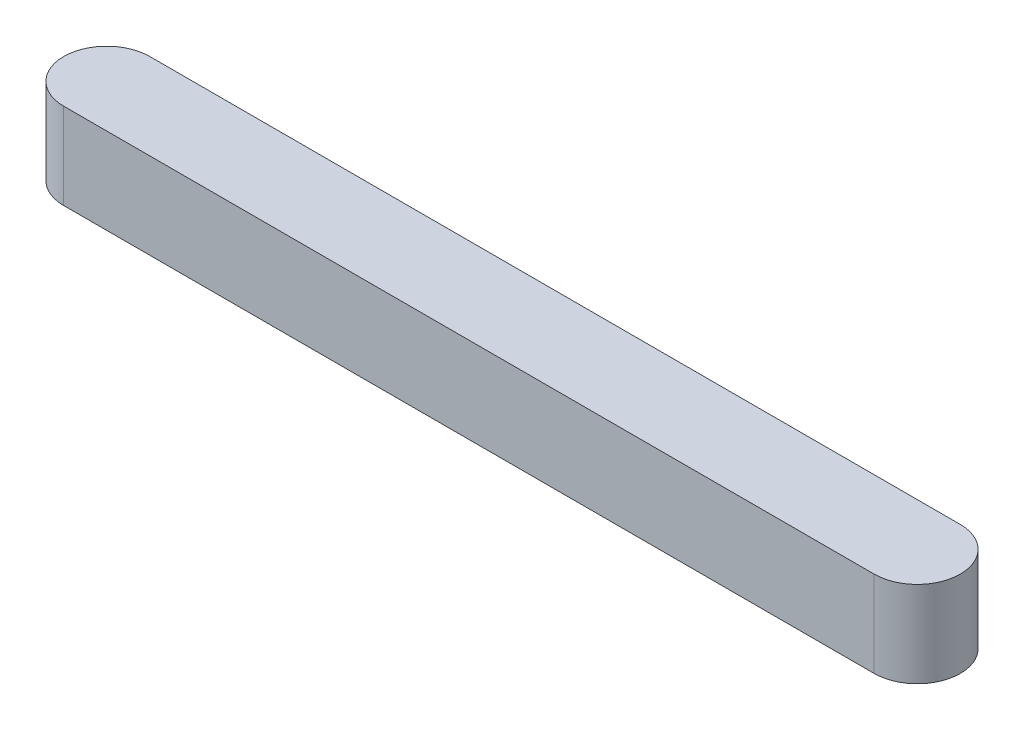
ISO-10303-21;
HEADER;
FILE_DESCRIPTION(('STEP AP214'),'2;1');
FILE_NAME('part.step','',(''),(''),'','','');
FILE_SCHEMA(('AUTOMOTIVE_DESIGN { 1 0 10303 214 1 1 1 1 }'));
ENDSEC;
DATA;
#1=APPLICATION_CONTEXT('core data for automotive mechanical design processes');
#2=APPLICATION_PROTOCOL_DEFINITION('international standard','automotive_design',2000,#1);
#3=PRODUCT_CONTEXT('',#1,'mechanical');
#4=PRODUCT('Part','Part','',(#3));
#5=PRODUCT_RELATED_PRODUCT_CATEGORY('part','',(#4));
#6=PRODUCT_DEFINITION_FORMATION('','',#4);
#7=PRODUCT_DEFINITION_CONTEXT('part definition',#1,'design');
#8=PRODUCT_DEFINITION('design','',#6,#7);
#9=PRODUCT_DEFINITION_SHAPE('','',#8);
#10=(LENGTH_UNIT() NAMED_UNIT(*) SI_UNIT(.MILLI.,.METRE.));
#11=(NAMED_UNIT(*) PLANE_ANGLE_UNIT() SI_UNIT($,.RADIAN.));
#12=(NAMED_UNIT(*) SI_UNIT($,.STERADIAN.) SOLID_ANGLE_UNIT());
#13=UNCERTAINTY_MEASURE_WITH_UNIT(LENGTH_MEASURE(1.E-05),#10,'distance_accuracy_value','');
#14=(GEOMETRIC_REPRESENTATION_CONTEXT(3) GLOBAL_UNCERTAINTY_ASSIGNED_CONTEXT((#13)) GLOBAL_UNIT_ASSIGNED_CONTEXT((#10,
#11,#12)) REPRESENTATION_CONTEXT('',''));
#15=CARTESIAN_POINT('',(0.,0.,0.));
#16=DIRECTION('',(0.,0.,1.));
#17=DIRECTION('',(1.,0.,0.));
#18=AXIS2_PLACEMENT_3D('',#15,#16,#17);
#19=CARTESIAN_POINT('',(-56.5,12.,0.));
#20=DIRECTION('',(0.,-1.,0.));
#21=DIRECTION('',(0.,0.,-1.));
#22=AXIS2_PLACEMENT_3D('',#19,#20,#21);
#23=CYLINDRICAL_SURFACE('',#22,6.00000000000002);
#24=CARTESIAN_POINT('',(-56.5,0.,0.));
#25=DIRECTION('',(0.,1.,0.));
#26=DIRECTION('',(0.,0.,1.));
#27=AXIS2_PLACEMENT_3D('',#24,#25,#26);
#28=CIRCLE('',#27,6.00000000000002);
#29=CARTESIAN_POINT('',(-56.5,0.,-6.00000000000002));
#30=VERTEX_POINT('',#29);
#31=CARTESIAN_POINT('',(-56.5,0.,6.00000000000002));
#32=VERTEX_POINT('',#31);
#33=EDGE_CURVE('E99',#30,#32,#28,.T.);
#34=ORIENTED_EDGE('',*,*,#33,.T.);
#35=DIRECTION('',(0.,-1.,0.));
#36=VECTOR('',#35,1.);
#37=CARTESIAN_POINT('',(-56.5,12.,6.00000000000002));
#38=LINE('',#37,#36);
#39=CARTESIAN_POINT('',(-56.5,12.,6.00000000000002));
#40=VERTEX_POINT('',#39);
#41=EDGE_CURVE('E11',#40,#32,#38,.T.);
#42=ORIENTED_EDGE('',*,*,#41,.F.);
#43=CARTESIAN_POINT('',(-56.5,12.,0.));
#44=DIRECTION('',(0.,1.,0.));
#45=DIRECTION('',(0.,0.,1.));
#46=AXIS2_PLACEMENT_3D('',#43,#44,#45);
#47=CIRCLE('',#46,6.00000000000002);
#48=CARTESIAN_POINT('',(-56.5,12.,-6.00000000000002));
#49=VERTEX_POINT('',#48);
#50=EDGE_CURVE('E86',#49,#40,#47,.T.);
#51=ORIENTED_EDGE('',*,*,#50,.F.);
#52=DIRECTION('',(0.,-1.,0.));
#53=VECTOR('',#52,1.);
#54=CARTESIAN_POINT('',(-56.5,12.,-6.00000000000002));
#55=LINE('',#54,#53);
#56=EDGE_CURVE('E96',#49,#30,#55,.T.);
#57=ORIENTED_EDGE('',*,*,#56,.T.);
#58=EDGE_LOOP('',(#34,#42,#51,#57));
#59=FACE_BOUND('',#58,.T.);
#60=ADVANCED_FACE('F40',(#59),#23,.T.);
#61=CARTESIAN_POINT('',(-56.5,12.,6.00000000000002));
#62=DIRECTION('',(0.,0.,-1.));
#63=DIRECTION('',(-1.,0.,0.));
#64=AXIS2_PLACEMENT_3D('',#61,#62,#63);
#65=PLANE('',#64);
#66=DIRECTION('',(1.,0.,0.));
#67=VECTOR('',#66,1.);
#68=CARTESIAN_POINT('',(-56.5,0.,6.00000000000002));
#69=LINE('',#68,#67);
#70=CARTESIAN_POINT('',(56.5,0.,6.));
#71=VERTEX_POINT('',#70);
#72=EDGE_CURVE('E95',#32,#71,#69,.T.);
#73=ORIENTED_EDGE('',*,*,#72,.T.);
#74=DIRECTION('',(0.,-1.,0.));
#75=VECTOR('',#74,1.);
#76=CARTESIAN_POINT('',(56.5,12.,6.));
#77=LINE('',#76,#75);
#78=CARTESIAN_POINT('',(56.5,12.,6.));
#79=VERTEX_POINT('',#78);
#80=EDGE_CURVE('E44',#79,#71,#77,.T.);
#81=ORIENTED_EDGE('',*,*,#80,.F.);
#82=DIRECTION('',(1.,0.,0.));
#83=VECTOR('',#82,1.);
#84=CARTESIAN_POINT('',(-56.5,12.,6.00000000000002));
#85=LINE('',#84,#83);
#86=EDGE_CURVE('E82',#40,#79,#85,.T.);
#87=ORIENTED_EDGE('',*,*,#86,.F.);
#88=ORIENTED_EDGE('',*,*,#41,.T.);
#89=EDGE_LOOP('',(#73,#81,#87,#88));
#90=FACE_BOUND('',#89,.T.);
#91=ADVANCED_FACE('F93',(#90),#65,.F.);
#92=CARTESIAN_POINT('',(56.5,12.,0.));
#93=DIRECTION('',(0.,-1.,0.));
#94=DIRECTION('',(0.,0.,-1.));
#95=AXIS2_PLACEMENT_3D('',#92,#93,#94);
#96=CYLINDRICAL_SURFACE('',#95,6.00000000000002);
#97=CARTESIAN_POINT('',(56.5,0.,0.));
#98=DIRECTION('',(0.,1.,0.));
#99=DIRECTION('',(0.,0.,1.));
#100=AXIS2_PLACEMENT_3D('',#97,#98,#99);
#101=CIRCLE('',#100,6.00000000000002);
#102=CARTESIAN_POINT('',(56.5,0.,-6.00000000000004));
#103=VERTEX_POINT('',#102);
#104=EDGE_CURVE('E70',#71,#103,#101,.T.);
#105=ORIENTED_EDGE('',*,*,#104,.T.);
#106=DIRECTION('',(0.,-1.,0.));
#107=VECTOR('',#106,1.);
#108=CARTESIAN_POINT('',(56.5,12.,-6.00000000000004));
#109=LINE('',#108,#107);
#110=CARTESIAN_POINT('',(56.5,12.,-6.00000000000004));
#111=VERTEX_POINT('',#110);
#112=EDGE_CURVE('E91',#111,#103,#109,.T.);
#113=ORIENTED_EDGE('',*,*,#112,.F.);
#114=CARTESIAN_POINT('',(56.5,12.,0.));
#115=DIRECTION('',(0.,1.,0.));
#116=DIRECTION('',(0.,0.,1.));
#117=AXIS2_PLACEMENT_3D('',#114,#115,#116);
#118=CIRCLE('',#117,6.00000000000002);
#119=EDGE_CURVE('E88',#79,#111,#118,.T.);
#120=ORIENTED_EDGE('',*,*,#119,.F.);
#121=ORIENTED_EDGE('',*,*,#80,.T.);
#122=EDGE_LOOP('',(#105,#113,#120,#121));
#123=FACE_BOUND('',#122,.T.);
#124=ADVANCED_FACE('F94',(#123),#96,.T.);
#125=CARTESIAN_POINT('',(-56.5,12.,-6.00000000000002));
#126=DIRECTION('',(0.,0.,1.));
#127=DIRECTION('',(1.,0.,0.));
#128=AXIS2_PLACEMENT_3D('',#125,#126,#127);
#129=PLANE('',#128);
#130=DIRECTION('',(-1.,0.,0.));
#131=VECTOR('',#130,1.);
#132=CARTESIAN_POINT('',(-56.5,0.,-6.00000000000002));
#133=LINE('',#132,#131);
#134=EDGE_CURVE('E77',#103,#30,#133,.T.);
#135=ORIENTED_EDGE('',*,*,#134,.T.);
#136=ORIENTED_EDGE('',*,*,#56,.F.);
#137=DIRECTION('',(-1.,0.,0.));
#138=VECTOR('',#137,1.);
#139=CARTESIAN_POINT('',(-56.5,12.,-6.00000000000002));
#140=LINE('',#139,#138);
#141=EDGE_CURVE('E52',#111,#49,#140,.T.);
#142=ORIENTED_EDGE('',*,*,#141,.F.);
#143=ORIENTED_EDGE('',*,*,#112,.T.);
#144=EDGE_LOOP('',(#135,#136,#142,#143));
#145=FACE_BOUND('',#144,.T.);
#146=ADVANCED_FACE('F110',(#145),#129,.F.);
#147=CARTESIAN_POINT('',(-56.5,12.,0.));
#148=DIRECTION('',(0.,1.,0.));
#149=DIRECTION('',(0.,0.,1.));
#150=AXIS2_PLACEMENT_3D('',#147,#148,#149);
#151=PLANE('',#150);
#152=ORIENTED_EDGE('',*,*,#50,.T.);
#153=ORIENTED_EDGE('',*,*,#86,.T.);
#154=ORIENTED_EDGE('',*,*,#119,.T.);
#155=ORIENTED_EDGE('',*,*,#141,.T.);
#156=EDGE_LOOP('',(#152,#153,#154,#155));
#157=FACE_BOUND('',#156,.T.);
#158=ADVANCED_FACE('F85',(#157),#151,.T.);
#159=CARTESIAN_POINT('',(-56.5,0.,0.));
#160=DIRECTION('',(0.,1.,0.));
#161=DIRECTION('',(0.,0.,1.));
#162=AXIS2_PLACEMENT_3D('',#159,#160,#161);
#163=PLANE('',#162);
#164=ORIENTED_EDGE('',*,*,#33,.F.);
#165=ORIENTED_EDGE('',*,*,#134,.F.);
#166=ORIENTED_EDGE('',*,*,#104,.F.);
#167=ORIENTED_EDGE('',*,*,#72,.F.);
#168=EDGE_LOOP('',(#164,#165,#166,#167));
#169=FACE_BOUND('',#168,.T.);
#170=ADVANCED_FACE('F109',(#169),#163,.F.);
#171=CLOSED_SHELL('',(#60,#91,#124,#146,#158,#170));
#172=MANIFOLD_SOLID_BREP('B2',#171);
#173=ADVANCED_BREP_SHAPE_REPRESENTATION('',(#18,#172),#14);
#174=SHAPE_DEFINITION_REPRESENTATION(#9,#173);
ENDSEC;
END-ISO-10303-21;
